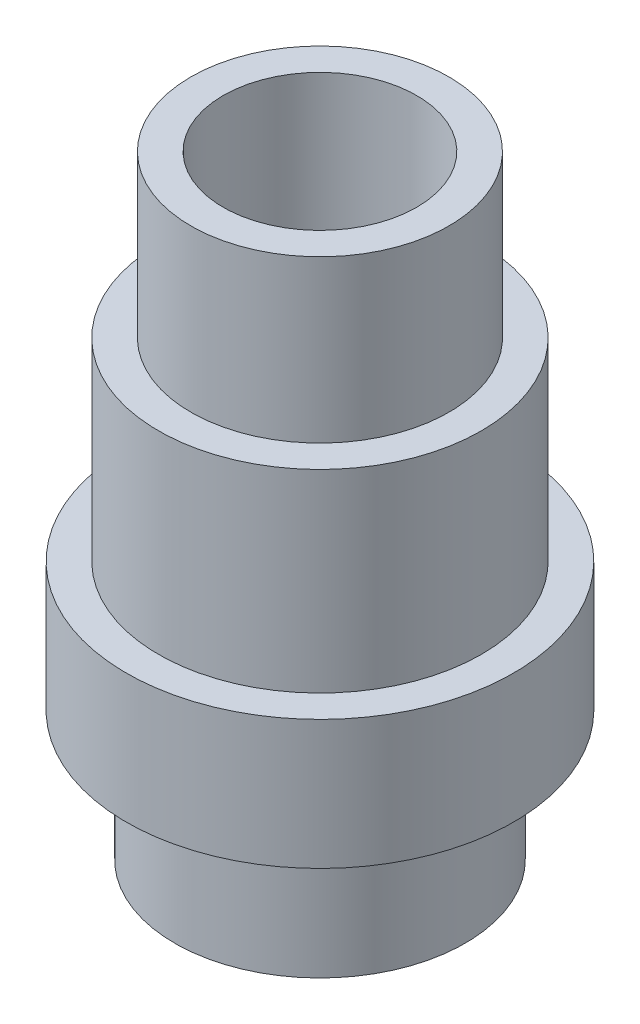
ISO-10303-21;
HEADER;
FILE_DESCRIPTION(('STEP AP214'),'2;1');
FILE_NAME('part.step','',(''),(''),'','','');
FILE_SCHEMA(('AUTOMOTIVE_DESIGN { 1 0 10303 214 1 1 1 1 }'));
ENDSEC;
DATA;
#1=APPLICATION_CONTEXT('core data for automotive mechanical design processes');
#2=APPLICATION_PROTOCOL_DEFINITION('international standard','automotive_design',2000,#1);
#3=PRODUCT_CONTEXT('',#1,'mechanical');
#4=PRODUCT('Part','Part','',(#3));
#5=PRODUCT_RELATED_PRODUCT_CATEGORY('part','',(#4));
#6=PRODUCT_DEFINITION_FORMATION('','',#4);
#7=PRODUCT_DEFINITION_CONTEXT('part definition',#1,'design');
#8=PRODUCT_DEFINITION('design','',#6,#7);
#9=PRODUCT_DEFINITION_SHAPE('','',#8);
#10=(LENGTH_UNIT() NAMED_UNIT(*) SI_UNIT(.MILLI.,.METRE.));
#11=(NAMED_UNIT(*) PLANE_ANGLE_UNIT() SI_UNIT($,.RADIAN.));
#12=(NAMED_UNIT(*) SI_UNIT($,.STERADIAN.) SOLID_ANGLE_UNIT());
#13=UNCERTAINTY_MEASURE_WITH_UNIT(LENGTH_MEASURE(1.E-05),#10,'distance_accuracy_value','');
#14=(GEOMETRIC_REPRESENTATION_CONTEXT(3) GLOBAL_UNCERTAINTY_ASSIGNED_CONTEXT((#13)) GLOBAL_UNIT_ASSIGNED_CONTEXT((#10,
#11,#12)) REPRESENTATION_CONTEXT('',''));
#15=CARTESIAN_POINT('',(0.,0.,0.));
#16=DIRECTION('',(0.,0.,1.));
#17=DIRECTION('',(1.,0.,0.));
#18=AXIS2_PLACEMENT_3D('',#15,#16,#17);
#19=CARTESIAN_POINT('',(-22.5,-50.7134570765661,0.));
#20=DIRECTION('',(0.,-1.,0.));
#21=DIRECTION('',(1.,0.,0.));
#22=AXIS2_PLACEMENT_3D('',#19,#20,#21);
#23=PLANE('',#22);
#24=CARTESIAN_POINT('',(0.,-50.7134570765661,0.));
#25=DIRECTION('',(0.,1.,0.));
#26=DIRECTION('',(-1.,0.,0.));
#27=AXIS2_PLACEMENT_3D('',#24,#25,#26);
#28=CIRCLE('',#27,15.);
#29=CARTESIAN_POINT('',(-15.,-50.7134570765661,0.));
#30=VERTEX_POINT('',#29);
#31=EDGE_CURVE('E10',#30,#30,#28,.T.);
#32=ORIENTED_EDGE('',*,*,#31,.T.);
#33=EDGE_LOOP('',(#32));
#34=FACE_BOUND('',#33,.T.);
#35=CARTESIAN_POINT('',(0.,-50.7134570765661,0.));
#36=DIRECTION('',(0.,1.,0.));
#37=DIRECTION('',(-1.,0.,0.));
#38=AXIS2_PLACEMENT_3D('',#35,#36,#37);
#39=CIRCLE('',#38,22.5);
#40=CARTESIAN_POINT('',(-22.5,-50.7134570765661,0.));
#41=VERTEX_POINT('',#40);
#42=EDGE_CURVE('E84',#41,#41,#39,.T.);
#43=ORIENTED_EDGE('',*,*,#42,.F.);
#44=EDGE_LOOP('',(#43));
#45=FACE_BOUND('',#44,.T.);
#46=ADVANCED_FACE('F41',(#34,#45),#23,.T.);
#47=CARTESIAN_POINT('',(0.,108.996519721578,0.));
#48=DIRECTION('',(0.,1.,0.));
#49=DIRECTION('',(-1.,0.,0.));
#50=AXIS2_PLACEMENT_3D('',#47,#48,#49);
#51=CYLINDRICAL_SURFACE('',#50,15.);
#52=CARTESIAN_POINT('',(0.,44.2865429234339,0.));
#53=DIRECTION('',(0.,1.,0.));
#54=DIRECTION('',(-1.,0.,0.));
#55=AXIS2_PLACEMENT_3D('',#52,#53,#54);
#56=CIRCLE('',#55,15.);
#57=CARTESIAN_POINT('',(-15.,44.2865429234339,0.));
#58=VERTEX_POINT('',#57);
#59=EDGE_CURVE('E48',#58,#58,#56,.T.);
#60=ORIENTED_EDGE('',*,*,#59,.T.);
#61=EDGE_LOOP('',(#60));
#62=FACE_BOUND('',#61,.T.);
#63=ORIENTED_EDGE('',*,*,#31,.F.);
#64=EDGE_LOOP('',(#63));
#65=FACE_BOUND('',#64,.T.);
#66=ADVANCED_FACE('F93',(#62,#65),#51,.F.);
#67=CARTESIAN_POINT('',(-15.,44.2865429234339,0.));
#68=DIRECTION('',(0.,1.,0.));
#69=DIRECTION('',(-1.,0.,0.));
#70=AXIS2_PLACEMENT_3D('',#67,#68,#69);
#71=PLANE('',#70);
#72=CARTESIAN_POINT('',(0.,44.2865429234339,0.));
#73=DIRECTION('',(0.,1.,0.));
#74=DIRECTION('',(-1.,0.,0.));
#75=AXIS2_PLACEMENT_3D('',#72,#73,#74);
#76=CIRCLE('',#75,20.);
#77=CARTESIAN_POINT('',(-20.,44.2865429234339,0.));
#78=VERTEX_POINT('',#77);
#79=EDGE_CURVE('E53',#78,#78,#76,.T.);
#80=ORIENTED_EDGE('',*,*,#79,.T.);
#81=EDGE_LOOP('',(#80));
#82=FACE_BOUND('',#81,.T.);
#83=ORIENTED_EDGE('',*,*,#59,.F.);
#84=EDGE_LOOP('',(#83));
#85=FACE_BOUND('',#84,.T.);
#86=ADVANCED_FACE('F97',(#82,#85),#71,.T.);
#87=CARTESIAN_POINT('',(0.,108.996519721578,0.));
#88=DIRECTION('',(0.,1.,0.));
#89=DIRECTION('',(-1.,0.,0.));
#90=AXIS2_PLACEMENT_3D('',#87,#88,#89);
#91=CYLINDRICAL_SURFACE('',#90,20.);
#92=CARTESIAN_POINT('',(0.,19.2865429234339,0.));
#93=DIRECTION('',(0.,1.,0.));
#94=DIRECTION('',(-1.,0.,0.));
#95=AXIS2_PLACEMENT_3D('',#92,#93,#94);
#96=CIRCLE('',#95,20.);
#97=CARTESIAN_POINT('',(-20.,19.2865429234339,0.));
#98=VERTEX_POINT('',#97);
#99=EDGE_CURVE('E58',#98,#98,#96,.T.);
#100=ORIENTED_EDGE('',*,*,#99,.T.);
#101=EDGE_LOOP('',(#100));
#102=FACE_BOUND('',#101,.T.);
#103=ORIENTED_EDGE('',*,*,#79,.F.);
#104=EDGE_LOOP('',(#103));
#105=FACE_BOUND('',#104,.T.);
#106=ADVANCED_FACE('F101',(#102,#105),#91,.T.);
#107=CARTESIAN_POINT('',(-20.,19.2865429234339,0.));
#108=DIRECTION('',(0.,1.,0.));
#109=DIRECTION('',(-1.,0.,0.));
#110=AXIS2_PLACEMENT_3D('',#107,#108,#109);
#111=PLANE('',#110);
#112=CARTESIAN_POINT('',(0.,19.2865429234339,0.));
#113=DIRECTION('',(0.,1.,0.));
#114=DIRECTION('',(-1.,0.,0.));
#115=AXIS2_PLACEMENT_3D('',#112,#113,#114);
#116=CIRCLE('',#115,25.);
#117=CARTESIAN_POINT('',(-25.,19.2865429234339,0.));
#118=VERTEX_POINT('',#117);
#119=EDGE_CURVE('E64',#118,#118,#116,.T.);
#120=ORIENTED_EDGE('',*,*,#119,.T.);
#121=EDGE_LOOP('',(#120));
#122=FACE_BOUND('',#121,.T.);
#123=ORIENTED_EDGE('',*,*,#99,.F.);
#124=EDGE_LOOP('',(#123));
#125=FACE_BOUND('',#124,.T.);
#126=ADVANCED_FACE('F108',(#122,#125),#111,.T.);
#127=CARTESIAN_POINT('',(0.,108.996519721578,0.));
#128=DIRECTION('',(0.,1.,0.));
#129=DIRECTION('',(-1.,0.,0.));
#130=AXIS2_PLACEMENT_3D('',#127,#128,#129);
#131=CYLINDRICAL_SURFACE('',#130,25.);
#132=CARTESIAN_POINT('',(0.,-10.7134570765661,0.));
#133=DIRECTION('',(0.,1.,0.));
#134=DIRECTION('',(-1.,0.,0.));
#135=AXIS2_PLACEMENT_3D('',#132,#133,#134);
#136=CIRCLE('',#135,25.);
#137=CARTESIAN_POINT('',(-25.,-10.7134570765661,0.));
#138=VERTEX_POINT('',#137);
#139=EDGE_CURVE('E68',#138,#138,#136,.T.);
#140=ORIENTED_EDGE('',*,*,#139,.T.);
#141=EDGE_LOOP('',(#140));
#142=FACE_BOUND('',#141,.T.);
#143=ORIENTED_EDGE('',*,*,#119,.F.);
#144=EDGE_LOOP('',(#143));
#145=FACE_BOUND('',#144,.T.);
#146=ADVANCED_FACE('F112',(#142,#145),#131,.T.);
#147=CARTESIAN_POINT('',(-25.,-10.7134570765661,0.));
#148=DIRECTION('',(0.,1.,0.));
#149=DIRECTION('',(-1.,0.,0.));
#150=AXIS2_PLACEMENT_3D('',#147,#148,#149);
#151=PLANE('',#150);
#152=CARTESIAN_POINT('',(0.,-10.7134570765661,0.));
#153=DIRECTION('',(0.,1.,0.));
#154=DIRECTION('',(-1.,0.,0.));
#155=AXIS2_PLACEMENT_3D('',#152,#153,#154);
#156=CIRCLE('',#155,30.);
#157=CARTESIAN_POINT('',(-30.,-10.7134570765661,0.));
#158=VERTEX_POINT('',#157);
#159=EDGE_CURVE('E72',#158,#158,#156,.T.);
#160=ORIENTED_EDGE('',*,*,#159,.T.);
#161=EDGE_LOOP('',(#160));
#162=FACE_BOUND('',#161,.T.);
#163=ORIENTED_EDGE('',*,*,#139,.F.);
#164=EDGE_LOOP('',(#163));
#165=FACE_BOUND('',#164,.T.);
#166=ADVANCED_FACE('F116',(#162,#165),#151,.T.);
#167=CARTESIAN_POINT('',(0.,108.996519721578,0.));
#168=DIRECTION('',(0.,1.,0.));
#169=DIRECTION('',(-1.,0.,0.));
#170=AXIS2_PLACEMENT_3D('',#167,#168,#169);
#171=CYLINDRICAL_SURFACE('',#170,30.);
#172=CARTESIAN_POINT('',(0.,-30.7134570765661,0.));
#173=DIRECTION('',(0.,1.,0.));
#174=DIRECTION('',(-1.,0.,0.));
#175=AXIS2_PLACEMENT_3D('',#172,#173,#174);
#176=CIRCLE('',#175,30.);
#177=CARTESIAN_POINT('',(-30.,-30.7134570765661,0.));
#178=VERTEX_POINT('',#177);
#179=EDGE_CURVE('E76',#178,#178,#176,.T.);
#180=ORIENTED_EDGE('',*,*,#179,.T.);
#181=EDGE_LOOP('',(#180));
#182=FACE_BOUND('',#181,.T.);
#183=ORIENTED_EDGE('',*,*,#159,.F.);
#184=EDGE_LOOP('',(#183));
#185=FACE_BOUND('',#184,.T.);
#186=ADVANCED_FACE('F120',(#182,#185),#171,.T.);
#187=CARTESIAN_POINT('',(-30.,-30.7134570765661,0.));
#188=DIRECTION('',(0.,-1.,0.));
#189=DIRECTION('',(1.,0.,0.));
#190=AXIS2_PLACEMENT_3D('',#187,#188,#189);
#191=PLANE('',#190);
#192=CARTESIAN_POINT('',(0.,-30.7134570765661,0.));
#193=DIRECTION('',(0.,1.,0.));
#194=DIRECTION('',(-1.,0.,0.));
#195=AXIS2_PLACEMENT_3D('',#192,#193,#194);
#196=CIRCLE('',#195,22.5);
#197=CARTESIAN_POINT('',(-22.5,-30.7134570765661,0.));
#198=VERTEX_POINT('',#197);
#199=EDGE_CURVE('E80',#198,#198,#196,.T.);
#200=ORIENTED_EDGE('',*,*,#199,.T.);
#201=EDGE_LOOP('',(#200));
#202=FACE_BOUND('',#201,.T.);
#203=ORIENTED_EDGE('',*,*,#179,.F.);
#204=EDGE_LOOP('',(#203));
#205=FACE_BOUND('',#204,.T.);
#206=ADVANCED_FACE('F124',(#202,#205),#191,.T.);
#207=CARTESIAN_POINT('',(0.,108.996519721578,0.));
#208=DIRECTION('',(0.,1.,0.));
#209=DIRECTION('',(-1.,0.,0.));
#210=AXIS2_PLACEMENT_3D('',#207,#208,#209);
#211=CYLINDRICAL_SURFACE('',#210,22.5);
#212=ORIENTED_EDGE('',*,*,#42,.T.);
#213=EDGE_LOOP('',(#212));
#214=FACE_BOUND('',#213,.T.);
#215=ORIENTED_EDGE('',*,*,#199,.F.);
#216=EDGE_LOOP('',(#215));
#217=FACE_BOUND('',#216,.T.);
#218=ADVANCED_FACE('F89',(#214,#217),#211,.T.);
#219=CLOSED_SHELL('',(#46,#66,#86,#106,#126,#146,#166,#186,#206,#218));
#220=MANIFOLD_SOLID_BREP('B2',#219);
#221=ADVANCED_BREP_SHAPE_REPRESENTATION('',(#18,#220),#14);
#222=SHAPE_DEFINITION_REPRESENTATION(#9,#221);
ENDSEC;
END-ISO-10303-21;
